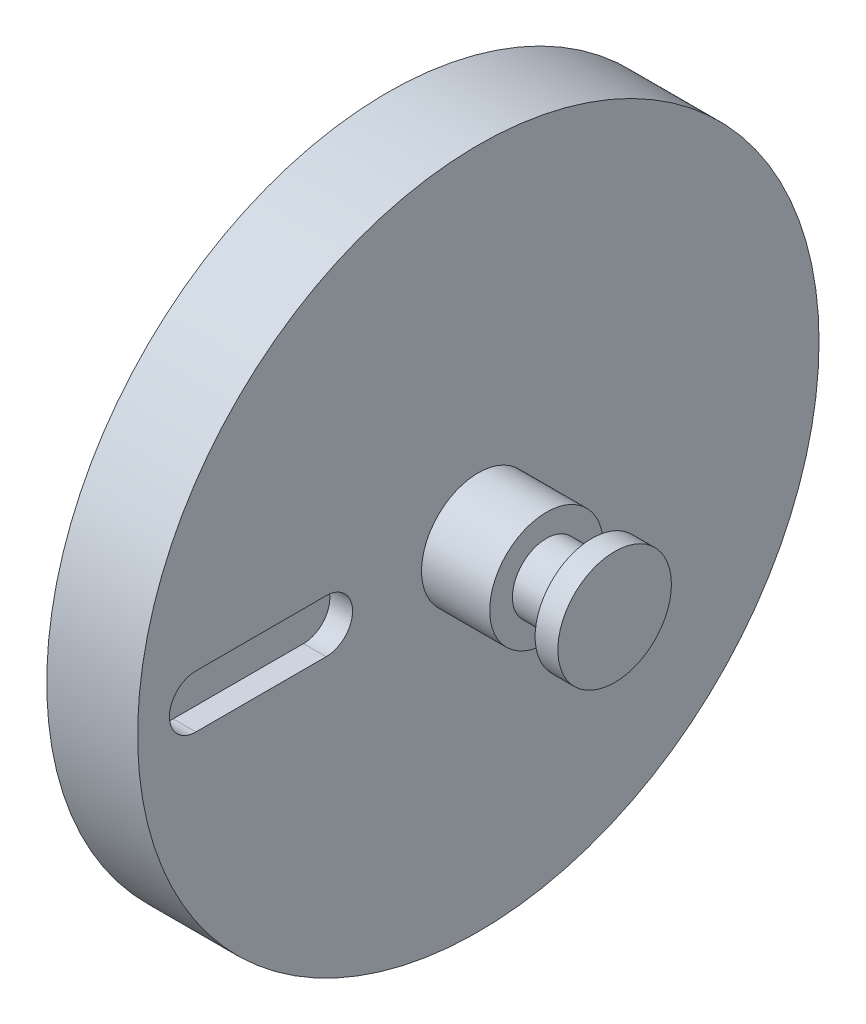
ISO-10303-21;
HEADER;
FILE_DESCRIPTION(('STEP AP214'),'2;1');
FILE_NAME('part.step','',(''),(''),'','','');
FILE_SCHEMA(('AUTOMOTIVE_DESIGN { 1 0 10303 214 1 1 1 1 }'));
ENDSEC;
DATA;
#1=APPLICATION_CONTEXT('core data for automotive mechanical design processes');
#2=APPLICATION_PROTOCOL_DEFINITION('international standard','automotive_design',2000,#1);
#3=PRODUCT_CONTEXT('',#1,'mechanical');
#4=PRODUCT('Part','Part','',(#3));
#5=PRODUCT_RELATED_PRODUCT_CATEGORY('part','',(#4));
#6=PRODUCT_DEFINITION_FORMATION('','',#4);
#7=PRODUCT_DEFINITION_CONTEXT('part definition',#1,'design');
#8=PRODUCT_DEFINITION('design','',#6,#7);
#9=PRODUCT_DEFINITION_SHAPE('','',#8);
#10=(LENGTH_UNIT() NAMED_UNIT(*) SI_UNIT(.MILLI.,.METRE.));
#11=(NAMED_UNIT(*) PLANE_ANGLE_UNIT() SI_UNIT($,.RADIAN.));
#12=(NAMED_UNIT(*) SI_UNIT($,.STERADIAN.) SOLID_ANGLE_UNIT());
#13=UNCERTAINTY_MEASURE_WITH_UNIT(LENGTH_MEASURE(1.E-05),#10,'distance_accuracy_value','');
#14=(GEOMETRIC_REPRESENTATION_CONTEXT(3) GLOBAL_UNCERTAINTY_ASSIGNED_CONTEXT((#13)) GLOBAL_UNIT_ASSIGNED_CONTEXT((#10,
#11,#12)) REPRESENTATION_CONTEXT('',''));
#15=CARTESIAN_POINT('',(0.,0.,0.));
#16=DIRECTION('',(0.,0.,1.));
#17=DIRECTION('',(1.,0.,0.));
#18=AXIS2_PLACEMENT_3D('',#15,#16,#17);
#19=CARTESIAN_POINT('',(10.,0.,0.));
#20=DIRECTION('',(1.,0.,0.));
#21=DIRECTION('',(0.,0.,-1.));
#22=AXIS2_PLACEMENT_3D('',#19,#20,#21);
#23=PLANE('',#22);
#24=CARTESIAN_POINT('',(10.,0.,0.));
#25=DIRECTION('',(1.,0.,0.));
#26=DIRECTION('',(0.,0.,-1.));
#27=AXIS2_PLACEMENT_3D('',#24,#25,#26);
#28=CIRCLE('',#27,12.5);
#29=CARTESIAN_POINT('',(10.,0.,-12.5));
#30=VERTEX_POINT('',#29);
#31=EDGE_CURVE('E11',#30,#30,#28,.T.);
#32=ORIENTED_EDGE('',*,*,#31,.F.);
#33=EDGE_LOOP('',(#32));
#34=FACE_BOUND('',#33,.T.);
#35=CARTESIAN_POINT('',(10.,0.,0.));
#36=DIRECTION('',(1.,0.,0.));
#37=DIRECTION('',(0.,0.,-1.));
#38=AXIS2_PLACEMENT_3D('',#35,#36,#37);
#39=CIRCLE('',#38,75.0000000000028);
#40=CARTESIAN_POINT('',(10.,0.,-75.0000000000028));
#41=VERTEX_POINT('',#40);
#42=EDGE_CURVE('E42',#41,#41,#39,.T.);
#43=ORIENTED_EDGE('',*,*,#42,.T.);
#44=EDGE_LOOP('',(#43));
#45=FACE_BOUND('',#44,.T.);
#46=DIRECTION('',(0.,0.,1.));
#47=VECTOR('',#46,1.);
#48=CARTESIAN_POINT('',(10.,-5.81700329645384,62.1777842851024));
#49=LINE('',#48,#47);
#50=CARTESIAN_POINT('',(10.,-5.81700329645384,33.4961045489761));
#51=VERTEX_POINT('',#50);
#52=CARTESIAN_POINT('',(10.,-5.81700329645384,62.1777842851024));
#53=VERTEX_POINT('',#52);
#54=EDGE_CURVE('E158',#51,#53,#49,.T.);
#55=ORIENTED_EDGE('',*,*,#54,.T.);
#56=CARTESIAN_POINT('',(10.,0.,62.1777842851024));
#57=DIRECTION('',(-1.,0.,0.));
#58=DIRECTION('',(0.,0.,1.));
#59=AXIS2_PLACEMENT_3D('',#56,#57,#58);
#60=CIRCLE('',#59,5.81700329645384);
#61=CARTESIAN_POINT('',(10.,5.81700329645384,62.1777842851024));
#62=VERTEX_POINT('',#61);
#63=EDGE_CURVE('E54',#53,#62,#60,.T.);
#64=ORIENTED_EDGE('',*,*,#63,.T.);
#65=DIRECTION('',(0.,0.,-1.));
#66=VECTOR('',#65,1.);
#67=CARTESIAN_POINT('',(10.,5.81700329645384,62.1777842851024));
#68=LINE('',#67,#66);
#69=CARTESIAN_POINT('',(10.,5.81700329645384,33.4961045489761));
#70=VERTEX_POINT('',#69);
#71=EDGE_CURVE('E149',#62,#70,#68,.T.);
#72=ORIENTED_EDGE('',*,*,#71,.T.);
#73=CARTESIAN_POINT('',(10.,0.,33.4961045489761));
#74=DIRECTION('',(-1.,0.,0.));
#75=DIRECTION('',(0.,0.,1.));
#76=AXIS2_PLACEMENT_3D('',#73,#74,#75);
#77=CIRCLE('',#76,5.81700329645384);
#78=EDGE_CURVE('E155',#70,#51,#77,.T.);
#79=ORIENTED_EDGE('',*,*,#78,.T.);
#80=EDGE_LOOP('',(#55,#64,#72,#79));
#81=FACE_BOUND('',#80,.T.);
#82=ADVANCED_FACE('F37',(#34,#45,#81),#23,.T.);
#83=CARTESIAN_POINT('',(-40.,0.,0.));
#84=DIRECTION('',(1.,0.,0.));
#85=DIRECTION('',(0.,0.,-1.));
#86=AXIS2_PLACEMENT_3D('',#83,#84,#85);
#87=CYLINDRICAL_SURFACE('',#86,12.5);
#88=CARTESIAN_POINT('',(-25.,0.,0.));
#89=DIRECTION('',(1.,0.,0.));
#90=DIRECTION('',(0.,0.,-1.));
#91=AXIS2_PLACEMENT_3D('',#88,#89,#90);
#92=CIRCLE('',#91,12.5);
#93=CARTESIAN_POINT('',(-25.,0.,-12.5));
#94=VERTEX_POINT('',#93);
#95=EDGE_CURVE('E228',#94,#94,#92,.T.);
#96=ORIENTED_EDGE('',*,*,#95,.T.);
#97=EDGE_LOOP('',(#96));
#98=FACE_BOUND('',#97,.T.);
#99=CARTESIAN_POINT('',(-10.,0.,0.));
#100=DIRECTION('',(1.,0.,0.));
#101=DIRECTION('',(0.,0.,-1.));
#102=AXIS2_PLACEMENT_3D('',#99,#100,#101);
#103=CIRCLE('',#102,12.5);
#104=CARTESIAN_POINT('',(-10.,0.,-12.5));
#105=VERTEX_POINT('',#104);
#106=EDGE_CURVE('E235',#105,#105,#103,.T.);
#107=ORIENTED_EDGE('',*,*,#106,.F.);
#108=EDGE_LOOP('',(#107));
#109=FACE_BOUND('',#108,.T.);
#110=ADVANCED_FACE('F255',(#98,#109),#87,.T.);
#111=CARTESIAN_POINT('',(10.,0.,0.));
#112=DIRECTION('',(-1.,0.,0.));
#113=DIRECTION('',(0.,0.,1.));
#114=AXIS2_PLACEMENT_3D('',#111,#112,#113);
#115=CYLINDRICAL_SURFACE('',#114,75.0000000000028);
#116=ORIENTED_EDGE('',*,*,#42,.F.);
#117=EDGE_LOOP('',(#116));
#118=FACE_BOUND('',#117,.T.);
#119=CARTESIAN_POINT('',(-10.,0.,0.));
#120=DIRECTION('',(1.,0.,0.));
#121=DIRECTION('',(0.,0.,-1.));
#122=AXIS2_PLACEMENT_3D('',#119,#120,#121);
#123=CIRCLE('',#122,75.0000000000028);
#124=CARTESIAN_POINT('',(-10.,0.,-75.0000000000028));
#125=VERTEX_POINT('',#124);
#126=EDGE_CURVE('E240',#125,#125,#123,.T.);
#127=ORIENTED_EDGE('',*,*,#126,.T.);
#128=EDGE_LOOP('',(#127));
#129=FACE_BOUND('',#128,.T.);
#130=ADVANCED_FACE('F45',(#118,#129),#115,.T.);
#131=CARTESIAN_POINT('',(40.,0.,0.));
#132=DIRECTION('',(-1.,0.,0.));
#133=DIRECTION('',(0.,0.,1.));
#134=AXIS2_PLACEMENT_3D('',#131,#132,#133);
#135=CYLINDRICAL_SURFACE('',#134,12.5);
#136=CARTESIAN_POINT('',(25.,0.,0.));
#137=DIRECTION('',(1.,0.,0.));
#138=DIRECTION('',(0.,0.,-1.));
#139=AXIS2_PLACEMENT_3D('',#136,#137,#138);
#140=CIRCLE('',#139,12.5);
#141=CARTESIAN_POINT('',(25.,0.,-12.5));
#142=VERTEX_POINT('',#141);
#143=EDGE_CURVE('E204',#142,#142,#140,.T.);
#144=ORIENTED_EDGE('',*,*,#143,.F.);
#145=EDGE_LOOP('',(#144));
#146=FACE_BOUND('',#145,.T.);
#147=ORIENTED_EDGE('',*,*,#31,.T.);
#148=EDGE_LOOP('',(#147));
#149=FACE_BOUND('',#148,.T.);
#150=ADVANCED_FACE('F251',(#146,#149),#135,.T.);
#151=CARTESIAN_POINT('',(-10.,0.,0.));
#152=DIRECTION('',(-1.,0.,0.));
#153=DIRECTION('',(0.,0.,-1.));
#154=AXIS2_PLACEMENT_3D('',#151,#152,#153);
#155=PLANE('',#154);
#156=CARTESIAN_POINT('',(-10.,0.,62.1777842851024));
#157=DIRECTION('',(-1.,0.,0.));
#158=DIRECTION('',(0.,0.,1.));
#159=AXIS2_PLACEMENT_3D('',#156,#157,#158);
#160=CIRCLE('',#159,5.81700329645384);
#161=CARTESIAN_POINT('',(-10.,-5.81700329645384,62.1777842851024));
#162=VERTEX_POINT('',#161);
#163=CARTESIAN_POINT('',(-10.,5.81700329645384,62.1777842851024));
#164=VERTEX_POINT('',#163);
#165=EDGE_CURVE('E64',#162,#164,#160,.T.);
#166=ORIENTED_EDGE('',*,*,#165,.F.);
#167=DIRECTION('',(0.,0.,1.));
#168=VECTOR('',#167,1.);
#169=CARTESIAN_POINT('',(-10.,-5.81700329645384,62.1777842851024));
#170=LINE('',#169,#168);
#171=CARTESIAN_POINT('',(-10.,-5.81700329645384,33.4961045489761));
#172=VERTEX_POINT('',#171);
#173=EDGE_CURVE('E171',#172,#162,#170,.T.);
#174=ORIENTED_EDGE('',*,*,#173,.F.);
#175=CARTESIAN_POINT('',(-10.,0.,33.4961045489761));
#176=DIRECTION('',(-1.,0.,0.));
#177=DIRECTION('',(0.,0.,1.));
#178=AXIS2_PLACEMENT_3D('',#175,#176,#177);
#179=CIRCLE('',#178,5.81700329645384);
#180=CARTESIAN_POINT('',(-10.,5.81700329645384,33.4961045489761));
#181=VERTEX_POINT('',#180);
#182=EDGE_CURVE('E183',#181,#172,#179,.T.);
#183=ORIENTED_EDGE('',*,*,#182,.F.);
#184=DIRECTION('',(0.,0.,-1.));
#185=VECTOR('',#184,1.);
#186=CARTESIAN_POINT('',(-10.,5.81700329645384,62.1777842851024));
#187=LINE('',#186,#185);
#188=EDGE_CURVE('E185',#164,#181,#187,.T.);
#189=ORIENTED_EDGE('',*,*,#188,.F.);
#190=EDGE_LOOP('',(#166,#174,#183,#189));
#191=FACE_BOUND('',#190,.T.);
#192=ORIENTED_EDGE('',*,*,#106,.T.);
#193=EDGE_LOOP('',(#192));
#194=FACE_BOUND('',#193,.T.);
#195=ORIENTED_EDGE('',*,*,#126,.F.);
#196=EDGE_LOOP('',(#195));
#197=FACE_BOUND('',#196,.T.);
#198=ADVANCED_FACE('F260',(#191,#194,#197),#155,.T.);
#199=CARTESIAN_POINT('',(-25.,0.,-12.5));
#200=DIRECTION('',(1.,0.,0.));
#201=DIRECTION('',(0.,0.,-1.));
#202=AXIS2_PLACEMENT_3D('',#199,#200,#201);
#203=PLANE('',#202);
#204=CARTESIAN_POINT('',(-25.,0.,0.));
#205=DIRECTION('',(1.,0.,0.));
#206=DIRECTION('',(0.,0.,-1.));
#207=AXIS2_PLACEMENT_3D('',#204,#205,#206);
#208=CIRCLE('',#207,7.5);
#209=CARTESIAN_POINT('',(-25.,0.,-7.5));
#210=VERTEX_POINT('',#209);
#211=EDGE_CURVE('E222',#210,#210,#208,.T.);
#212=ORIENTED_EDGE('',*,*,#211,.T.);
#213=EDGE_LOOP('',(#212));
#214=FACE_BOUND('',#213,.T.);
#215=ORIENTED_EDGE('',*,*,#95,.F.);
#216=EDGE_LOOP('',(#215));
#217=FACE_BOUND('',#216,.T.);
#218=ADVANCED_FACE('F259',(#214,#217),#203,.F.);
#219=CARTESIAN_POINT('',(-40.,0.,0.));
#220=DIRECTION('',(1.,0.,0.));
#221=DIRECTION('',(0.,0.,-1.));
#222=AXIS2_PLACEMENT_3D('',#219,#220,#221);
#223=CYLINDRICAL_SURFACE('',#222,7.5);
#224=DIRECTION('',(1.,0.,0.));
#225=VECTOR('',#224,1.);
#226=CARTESIAN_POINT('',(-35.,0.,-7.5));
#227=LINE('',#226,#225);
#228=CARTESIAN_POINT('',(-35.,0.,-7.5));
#229=VERTEX_POINT('',#228);
#230=EDGE_CURVE('E217',#229,#210,#227,.T.);
#231=ORIENTED_EDGE('',*,*,#230,.T.);
#232=ORIENTED_EDGE('',*,*,#211,.F.);
#233=ORIENTED_EDGE('',*,*,#230,.F.);
#234=CARTESIAN_POINT('',(-35.,0.,0.));
#235=DIRECTION('',(1.,0.,0.));
#236=DIRECTION('',(0.,0.,-1.));
#237=AXIS2_PLACEMENT_3D('',#234,#235,#236);
#238=CIRCLE('',#237,7.5);
#239=EDGE_CURVE('E218',#229,#229,#238,.T.);
#240=ORIENTED_EDGE('',*,*,#239,.T.);
#241=EDGE_LOOP('',(#231,#232,#233,#240));
#242=FACE_BOUND('',#241,.T.);
#243=ADVANCED_FACE('F270',(#242),#223,.T.);
#244=CARTESIAN_POINT('',(-35.,0.,-12.5));
#245=DIRECTION('',(-1.,0.,0.));
#246=DIRECTION('',(0.,0.,1.));
#247=AXIS2_PLACEMENT_3D('',#244,#245,#246);
#248=PLANE('',#247);
#249=CARTESIAN_POINT('',(-35.,0.,0.));
#250=DIRECTION('',(1.,0.,0.));
#251=DIRECTION('',(0.,0.,-1.));
#252=AXIS2_PLACEMENT_3D('',#249,#250,#251);
#253=CIRCLE('',#252,12.5);
#254=CARTESIAN_POINT('',(-35.,0.,-12.5));
#255=VERTEX_POINT('',#254);
#256=EDGE_CURVE('E225',#255,#255,#253,.T.);
#257=ORIENTED_EDGE('',*,*,#256,.T.);
#258=EDGE_LOOP('',(#257));
#259=FACE_BOUND('',#258,.T.);
#260=ORIENTED_EDGE('',*,*,#239,.F.);
#261=EDGE_LOOP('',(#260));
#262=FACE_BOUND('',#261,.T.);
#263=ADVANCED_FACE('F309',(#259,#262),#248,.F.);
#264=CARTESIAN_POINT('',(-40.,0.,0.));
#265=DIRECTION('',(-1.,0.,0.));
#266=DIRECTION('',(0.,0.,-1.));
#267=AXIS2_PLACEMENT_3D('',#264,#265,#266);
#268=PLANE('',#267);
#269=CARTESIAN_POINT('',(-40.,0.,0.));
#270=DIRECTION('',(1.,0.,0.));
#271=DIRECTION('',(0.,0.,-1.));
#272=AXIS2_PLACEMENT_3D('',#269,#270,#271);
#273=CIRCLE('',#272,12.5);
#274=CARTESIAN_POINT('',(-40.,0.,-12.5));
#275=VERTEX_POINT('',#274);
#276=EDGE_CURVE('E231',#275,#275,#273,.T.);
#277=ORIENTED_EDGE('',*,*,#276,.F.);
#278=EDGE_LOOP('',(#277));
#279=FACE_BOUND('',#278,.T.);
#280=ADVANCED_FACE('F311',(#279),#268,.T.);
#281=ORIENTED_EDGE('',*,*,#256,.F.);
#282=EDGE_LOOP('',(#281));
#283=FACE_BOUND('',#282,.T.);
#284=ORIENTED_EDGE('',*,*,#276,.T.);
#285=EDGE_LOOP('',(#284));
#286=FACE_BOUND('',#285,.T.);
#287=ADVANCED_FACE('F285',(#283,#286),#87,.T.);
#288=CARTESIAN_POINT('',(35.,0.,-12.5));
#289=DIRECTION('',(1.,0.,0.));
#290=DIRECTION('',(0.,0.,-1.));
#291=AXIS2_PLACEMENT_3D('',#288,#289,#290);
#292=PLANE('',#291);
#293=CARTESIAN_POINT('',(35.,0.,0.));
#294=DIRECTION('',(1.,0.,0.));
#295=DIRECTION('',(0.,0.,-1.));
#296=AXIS2_PLACEMENT_3D('',#293,#294,#295);
#297=CIRCLE('',#296,7.5);
#298=CARTESIAN_POINT('',(35.,0.,-7.5));
#299=VERTEX_POINT('',#298);
#300=EDGE_CURVE('E201',#299,#299,#297,.T.);
#301=ORIENTED_EDGE('',*,*,#300,.T.);
#302=EDGE_LOOP('',(#301));
#303=FACE_BOUND('',#302,.T.);
#304=CARTESIAN_POINT('',(35.,0.,0.));
#305=DIRECTION('',(1.,0.,0.));
#306=DIRECTION('',(0.,0.,-1.));
#307=AXIS2_PLACEMENT_3D('',#304,#305,#306);
#308=CIRCLE('',#307,12.5);
#309=CARTESIAN_POINT('',(35.,0.,-12.5));
#310=VERTEX_POINT('',#309);
#311=EDGE_CURVE('E211',#310,#310,#308,.T.);
#312=ORIENTED_EDGE('',*,*,#311,.F.);
#313=EDGE_LOOP('',(#312));
#314=FACE_BOUND('',#313,.T.);
#315=ADVANCED_FACE('F302',(#303,#314),#292,.F.);
#316=CARTESIAN_POINT('',(40.,0.,0.));
#317=DIRECTION('',(1.,0.,0.));
#318=DIRECTION('',(0.,0.,-1.));
#319=AXIS2_PLACEMENT_3D('',#316,#317,#318);
#320=CYLINDRICAL_SURFACE('',#319,7.5);
#321=DIRECTION('',(-1.,0.,0.));
#322=VECTOR('',#321,1.);
#323=CARTESIAN_POINT('',(35.,0.,-7.5));
#324=LINE('',#323,#322);
#325=CARTESIAN_POINT('',(25.,0.,-7.5));
#326=VERTEX_POINT('',#325);
#327=EDGE_CURVE('E199',#326,#299,#324,.F.);
#328=ORIENTED_EDGE('',*,*,#327,.T.);
#329=ORIENTED_EDGE('',*,*,#300,.F.);
#330=ORIENTED_EDGE('',*,*,#327,.F.);
#331=CARTESIAN_POINT('',(25.,0.,0.));
#332=DIRECTION('',(1.,0.,0.));
#333=DIRECTION('',(0.,0.,-1.));
#334=AXIS2_PLACEMENT_3D('',#331,#332,#333);
#335=CIRCLE('',#334,7.5);
#336=EDGE_CURVE('E203',#326,#326,#335,.T.);
#337=ORIENTED_EDGE('',*,*,#336,.T.);
#338=EDGE_LOOP('',(#328,#329,#330,#337));
#339=FACE_BOUND('',#338,.T.);
#340=ADVANCED_FACE('F293',(#339),#320,.T.);
#341=CARTESIAN_POINT('',(25.,0.,-12.5));
#342=DIRECTION('',(-1.,0.,0.));
#343=DIRECTION('',(0.,0.,1.));
#344=AXIS2_PLACEMENT_3D('',#341,#342,#343);
#345=PLANE('',#344);
#346=ORIENTED_EDGE('',*,*,#143,.T.);
#347=EDGE_LOOP('',(#346));
#348=FACE_BOUND('',#347,.T.);
#349=ORIENTED_EDGE('',*,*,#336,.F.);
#350=EDGE_LOOP('',(#349));
#351=FACE_BOUND('',#350,.T.);
#352=ADVANCED_FACE('F286',(#348,#351),#345,.F.);
#353=CARTESIAN_POINT('',(40.,0.,0.));
#354=DIRECTION('',(1.,0.,0.));
#355=DIRECTION('',(0.,0.,-1.));
#356=AXIS2_PLACEMENT_3D('',#353,#354,#355);
#357=PLANE('',#356);
#358=CARTESIAN_POINT('',(40.,0.,0.));
#359=DIRECTION('',(1.,0.,0.));
#360=DIRECTION('',(0.,0.,-1.));
#361=AXIS2_PLACEMENT_3D('',#358,#359,#360);
#362=CIRCLE('',#361,12.5);
#363=CARTESIAN_POINT('',(40.,0.,-12.5));
#364=VERTEX_POINT('',#363);
#365=EDGE_CURVE('E242',#364,#364,#362,.T.);
#366=ORIENTED_EDGE('',*,*,#365,.T.);
#367=EDGE_LOOP('',(#366));
#368=FACE_BOUND('',#367,.T.);
#369=ADVANCED_FACE('F289',(#368),#357,.T.);
#370=ORIENTED_EDGE('',*,*,#311,.T.);
#371=EDGE_LOOP('',(#370));
#372=FACE_BOUND('',#371,.T.);
#373=ORIENTED_EDGE('',*,*,#365,.F.);
#374=EDGE_LOOP('',(#373));
#375=FACE_BOUND('',#374,.T.);
#376=ADVANCED_FACE('F272',(#372,#375),#135,.T.);
#377=CARTESIAN_POINT('',(-5.,0.,62.1777842851024));
#378=DIRECTION('',(-1.,0.,0.));
#379=DIRECTION('',(0.,0.,1.));
#380=AXIS2_PLACEMENT_3D('',#377,#378,#379);
#381=CYLINDRICAL_SURFACE('',#380,5.81700329645384);
#382=ORIENTED_EDGE('',*,*,#165,.T.);
#383=DIRECTION('',(-1.,0.,0.));
#384=VECTOR('',#383,1.);
#385=CARTESIAN_POINT('',(-5.,5.81700329645384,62.1777842851024));
#386=LINE('',#385,#384);
#387=CARTESIAN_POINT('',(-5.,5.81700329645384,62.1777842851024));
#388=VERTEX_POINT('',#387);
#389=EDGE_CURVE('E178',#388,#164,#386,.T.);
#390=ORIENTED_EDGE('',*,*,#389,.F.);
#391=CARTESIAN_POINT('',(-5.,0.,62.1777842851024));
#392=DIRECTION('',(-1.,0.,0.));
#393=DIRECTION('',(0.,0.,1.));
#394=AXIS2_PLACEMENT_3D('',#391,#392,#393);
#395=CIRCLE('',#394,5.81700329645384);
#396=CARTESIAN_POINT('',(-5.,-5.81700329645384,62.1777842851024));
#397=VERTEX_POINT('',#396);
#398=EDGE_CURVE('E170',#397,#388,#395,.T.);
#399=ORIENTED_EDGE('',*,*,#398,.F.);
#400=DIRECTION('',(-1.,0.,0.));
#401=VECTOR('',#400,1.);
#402=CARTESIAN_POINT('',(-5.,-5.81700329645384,62.1777842851024));
#403=LINE('',#402,#401);
#404=EDGE_CURVE('E190',#397,#162,#403,.T.);
#405=ORIENTED_EDGE('',*,*,#404,.T.);
#406=EDGE_LOOP('',(#382,#390,#399,#405));
#407=FACE_BOUND('',#406,.T.);
#408=ADVANCED_FACE('F295',(#407),#381,.F.);
#409=CARTESIAN_POINT('',(-5.,-5.81700329645384,62.1777842851024));
#410=DIRECTION('',(0.,-1.,0.));
#411=DIRECTION('',(0.,0.,-1.));
#412=AXIS2_PLACEMENT_3D('',#409,#410,#411);
#413=PLANE('',#412);
#414=ORIENTED_EDGE('',*,*,#173,.T.);
#415=ORIENTED_EDGE('',*,*,#404,.F.);
#416=DIRECTION('',(0.,0.,1.));
#417=VECTOR('',#416,1.);
#418=CARTESIAN_POINT('',(-5.,-5.81700329645384,62.1777842851024));
#419=LINE('',#418,#417);
#420=CARTESIAN_POINT('',(-5.,-5.81700329645384,33.4961045489761));
#421=VERTEX_POINT('',#420);
#422=EDGE_CURVE('E179',#421,#397,#419,.T.);
#423=ORIENTED_EDGE('',*,*,#422,.F.);
#424=DIRECTION('',(-1.,0.,0.));
#425=VECTOR('',#424,1.);
#426=CARTESIAN_POINT('',(-5.,-5.81700329645384,33.4961045489761));
#427=LINE('',#426,#425);
#428=EDGE_CURVE('E195',#421,#172,#427,.T.);
#429=ORIENTED_EDGE('',*,*,#428,.T.);
#430=EDGE_LOOP('',(#414,#415,#423,#429));
#431=FACE_BOUND('',#430,.T.);
#432=ADVANCED_FACE('F370',(#431),#413,.F.);
#433=CARTESIAN_POINT('',(-5.,0.,33.4961045489761));
#434=DIRECTION('',(-1.,0.,0.));
#435=DIRECTION('',(0.,0.,1.));
#436=AXIS2_PLACEMENT_3D('',#433,#434,#435);
#437=CYLINDRICAL_SURFACE('',#436,5.81700329645384);
#438=ORIENTED_EDGE('',*,*,#182,.T.);
#439=ORIENTED_EDGE('',*,*,#428,.F.);
#440=CARTESIAN_POINT('',(-5.,0.,33.4961045489761));
#441=DIRECTION('',(-1.,0.,0.));
#442=DIRECTION('',(0.,0.,1.));
#443=AXIS2_PLACEMENT_3D('',#440,#441,#442);
#444=CIRCLE('',#443,5.81700329645384);
#445=CARTESIAN_POINT('',(-5.,5.81700329645384,33.4961045489761));
#446=VERTEX_POINT('',#445);
#447=EDGE_CURVE('E173',#446,#421,#444,.T.);
#448=ORIENTED_EDGE('',*,*,#447,.F.);
#449=DIRECTION('',(-1.,0.,0.));
#450=VECTOR('',#449,1.);
#451=CARTESIAN_POINT('',(-5.,5.81700329645384,33.4961045489761));
#452=LINE('',#451,#450);
#453=EDGE_CURVE('E193',#446,#181,#452,.T.);
#454=ORIENTED_EDGE('',*,*,#453,.T.);
#455=EDGE_LOOP('',(#438,#439,#448,#454));
#456=FACE_BOUND('',#455,.T.);
#457=ADVANCED_FACE('F374',(#456),#437,.F.);
#458=CARTESIAN_POINT('',(-5.,5.81700329645384,62.1777842851024));
#459=DIRECTION('',(0.,1.,0.));
#460=DIRECTION('',(0.,0.,1.));
#461=AXIS2_PLACEMENT_3D('',#458,#459,#460);
#462=PLANE('',#461);
#463=ORIENTED_EDGE('',*,*,#188,.T.);
#464=ORIENTED_EDGE('',*,*,#453,.F.);
#465=DIRECTION('',(0.,0.,-1.));
#466=VECTOR('',#465,1.);
#467=CARTESIAN_POINT('',(-5.,5.81700329645384,62.1777842851024));
#468=LINE('',#467,#466);
#469=EDGE_CURVE('E168',#388,#446,#468,.T.);
#470=ORIENTED_EDGE('',*,*,#469,.F.);
#471=ORIENTED_EDGE('',*,*,#389,.T.);
#472=EDGE_LOOP('',(#463,#464,#470,#471));
#473=FACE_BOUND('',#472,.T.);
#474=ADVANCED_FACE('F384',(#473),#462,.F.);
#475=CARTESIAN_POINT('',(-5.,0.,62.1777842851024));
#476=DIRECTION('',(-1.,0.,0.));
#477=DIRECTION('',(0.,0.,1.));
#478=AXIS2_PLACEMENT_3D('',#475,#476,#477);
#479=PLANE('',#478);
#480=ORIENTED_EDGE('',*,*,#398,.T.);
#481=ORIENTED_EDGE('',*,*,#469,.T.);
#482=ORIENTED_EDGE('',*,*,#447,.T.);
#483=ORIENTED_EDGE('',*,*,#422,.T.);
#484=EDGE_LOOP('',(#480,#481,#482,#483));
#485=FACE_BOUND('',#484,.T.);
#486=ADVANCED_FACE('F395',(#485),#479,.T.);
#487=CARTESIAN_POINT('',(5.,0.,62.1777842851024));
#488=DIRECTION('',(1.,0.,0.));
#489=DIRECTION('',(0.,0.,-1.));
#490=AXIS2_PLACEMENT_3D('',#487,#488,#489);
#491=CYLINDRICAL_SURFACE('',#490,5.81700329645384);
#492=ORIENTED_EDGE('',*,*,#63,.F.);
#493=DIRECTION('',(1.,0.,0.));
#494=VECTOR('',#493,1.);
#495=CARTESIAN_POINT('',(5.,-5.81700329645384,62.1777842851024));
#496=LINE('',#495,#494);
#497=CARTESIAN_POINT('',(5.,-5.81700329645384,62.1777842851024));
#498=VERTEX_POINT('',#497);
#499=EDGE_CURVE('E133',#498,#53,#496,.T.);
#500=ORIENTED_EDGE('',*,*,#499,.F.);
#501=CARTESIAN_POINT('',(5.,0.,62.1777842851024));
#502=DIRECTION('',(-1.,0.,0.));
#503=DIRECTION('',(0.,0.,1.));
#504=AXIS2_PLACEMENT_3D('',#501,#502,#503);
#505=CIRCLE('',#504,5.81700329645384);
#506=CARTESIAN_POINT('',(5.,5.81700329645384,62.1777842851024));
#507=VERTEX_POINT('',#506);
#508=EDGE_CURVE('E143',#498,#507,#505,.T.);
#509=ORIENTED_EDGE('',*,*,#508,.T.);
#510=DIRECTION('',(1.,0.,0.));
#511=VECTOR('',#510,1.);
#512=CARTESIAN_POINT('',(5.,5.81700329645384,62.1777842851024));
#513=LINE('',#512,#511);
#514=EDGE_CURVE('E165',#507,#62,#513,.T.);
#515=ORIENTED_EDGE('',*,*,#514,.T.);
#516=EDGE_LOOP('',(#492,#500,#509,#515));
#517=FACE_BOUND('',#516,.T.);
#518=ADVANCED_FACE('F145',(#517),#491,.F.);
#519=CARTESIAN_POINT('',(5.,5.81700329645384,62.1777842851024));
#520=DIRECTION('',(0.,-1.,0.));
#521=DIRECTION('',(0.,0.,-1.));
#522=AXIS2_PLACEMENT_3D('',#519,#520,#521);
#523=PLANE('',#522);
#524=ORIENTED_EDGE('',*,*,#71,.F.);
#525=ORIENTED_EDGE('',*,*,#514,.F.);
#526=DIRECTION('',(0.,0.,-1.));
#527=VECTOR('',#526,1.);
#528=CARTESIAN_POINT('',(5.,5.81700329645384,62.1777842851024));
#529=LINE('',#528,#527);
#530=CARTESIAN_POINT('',(5.,5.81700329645384,33.4961045489761));
#531=VERTEX_POINT('',#530);
#532=EDGE_CURVE('E148',#507,#531,#529,.T.);
#533=ORIENTED_EDGE('',*,*,#532,.T.);
#534=DIRECTION('',(1.,0.,0.));
#535=VECTOR('',#534,1.);
#536=CARTESIAN_POINT('',(5.,5.81700329645384,33.4961045489761));
#537=LINE('',#536,#535);
#538=EDGE_CURVE('E163',#531,#70,#537,.T.);
#539=ORIENTED_EDGE('',*,*,#538,.T.);
#540=EDGE_LOOP('',(#524,#525,#533,#539));
#541=FACE_BOUND('',#540,.T.);
#542=ADVANCED_FACE('F413',(#541),#523,.T.);
#543=CARTESIAN_POINT('',(5.,0.,33.4961045489761));
#544=DIRECTION('',(1.,0.,0.));
#545=DIRECTION('',(0.,0.,-1.));
#546=AXIS2_PLACEMENT_3D('',#543,#544,#545);
#547=CYLINDRICAL_SURFACE('',#546,5.81700329645384);
#548=ORIENTED_EDGE('',*,*,#78,.F.);
#549=ORIENTED_EDGE('',*,*,#538,.F.);
#550=CARTESIAN_POINT('',(5.,0.,33.4961045489761));
#551=DIRECTION('',(-1.,0.,0.));
#552=DIRECTION('',(0.,0.,1.));
#553=AXIS2_PLACEMENT_3D('',#550,#551,#552);
#554=CIRCLE('',#553,5.81700329645384);
#555=CARTESIAN_POINT('',(5.,-5.81700329645384,33.4961045489761));
#556=VERTEX_POINT('',#555);
#557=EDGE_CURVE('E138',#531,#556,#554,.T.);
#558=ORIENTED_EDGE('',*,*,#557,.T.);
#559=DIRECTION('',(1.,0.,0.));
#560=VECTOR('',#559,1.);
#561=CARTESIAN_POINT('',(5.,-5.81700329645384,33.4961045489761));
#562=LINE('',#561,#560);
#563=EDGE_CURVE('E137',#556,#51,#562,.T.);
#564=ORIENTED_EDGE('',*,*,#563,.T.);
#565=EDGE_LOOP('',(#548,#549,#558,#564));
#566=FACE_BOUND('',#565,.T.);
#567=ADVANCED_FACE('F424',(#566),#547,.F.);
#568=CARTESIAN_POINT('',(5.,-5.81700329645384,62.1777842851024));
#569=DIRECTION('',(0.,1.,0.));
#570=DIRECTION('',(0.,0.,1.));
#571=AXIS2_PLACEMENT_3D('',#568,#569,#570);
#572=PLANE('',#571);
#573=ORIENTED_EDGE('',*,*,#54,.F.);
#574=ORIENTED_EDGE('',*,*,#563,.F.);
#575=DIRECTION('',(0.,0.,1.));
#576=VECTOR('',#575,1.);
#577=CARTESIAN_POINT('',(5.,-5.81700329645384,62.1777842851024));
#578=LINE('',#577,#576);
#579=EDGE_CURVE('E131',#556,#498,#578,.T.);
#580=ORIENTED_EDGE('',*,*,#579,.T.);
#581=ORIENTED_EDGE('',*,*,#499,.T.);
#582=EDGE_LOOP('',(#573,#574,#580,#581));
#583=FACE_BOUND('',#582,.T.);
#584=ADVANCED_FACE('F134',(#583),#572,.T.);
#585=CARTESIAN_POINT('',(5.,0.,62.1777842851024));
#586=DIRECTION('',(1.,0.,0.));
#587=DIRECTION('',(0.,0.,1.));
#588=AXIS2_PLACEMENT_3D('',#585,#586,#587);
#589=PLANE('',#588);
#590=ORIENTED_EDGE('',*,*,#508,.F.);
#591=ORIENTED_EDGE('',*,*,#579,.F.);
#592=ORIENTED_EDGE('',*,*,#557,.F.);
#593=ORIENTED_EDGE('',*,*,#532,.F.);
#594=EDGE_LOOP('',(#590,#591,#592,#593));
#595=FACE_BOUND('',#594,.T.);
#596=ADVANCED_FACE('F146',(#595),#589,.T.);
#597=CLOSED_SHELL('',(#82,#110,#130,#150,#198,#218,#243,#263,#280,#287,#315,#340,#352,#369,#376,
#408,#432,#457,#474,#486,#518,#542,#567,#584,#596));
#598=MANIFOLD_SOLID_BREP('B2',#597);
#599=ADVANCED_BREP_SHAPE_REPRESENTATION('',(#18,#598),#14);
#600=SHAPE_DEFINITION_REPRESENTATION(#9,#599);
ENDSEC;
END-ISO-10303-21;
